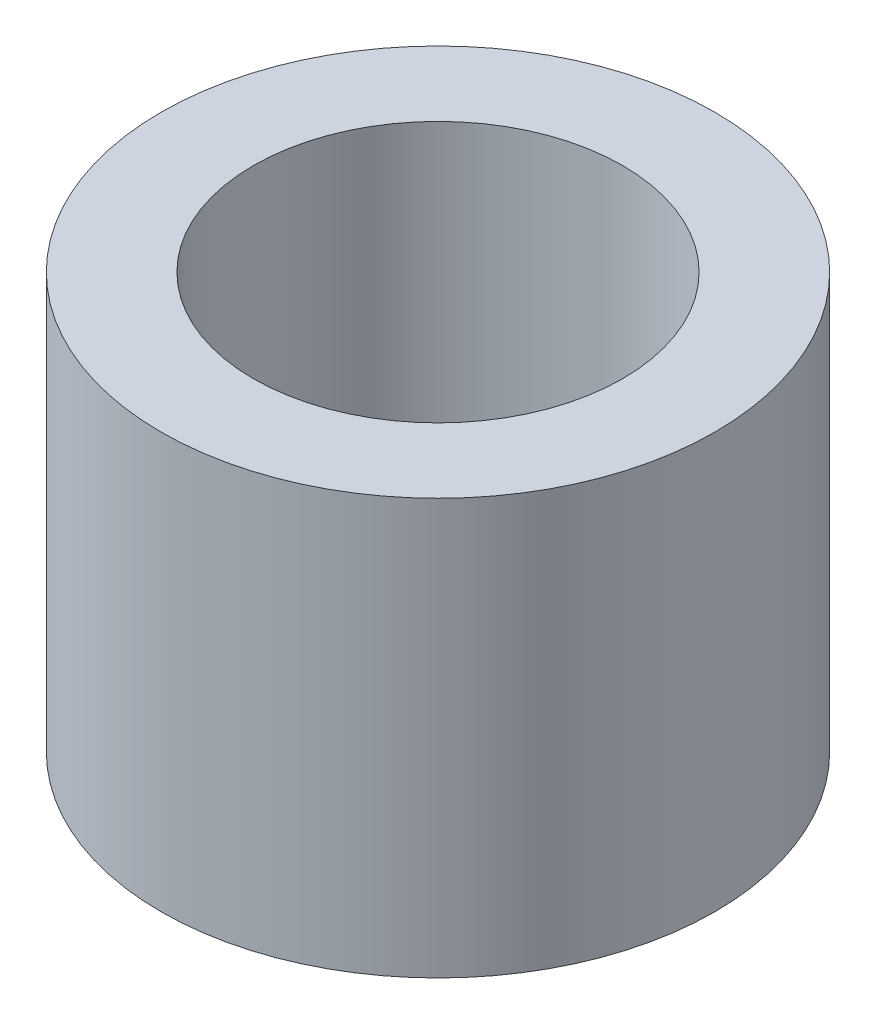
ISO-10303-21;
HEADER;
FILE_DESCRIPTION(('STEP AP214'),'2;1');
FILE_NAME('part.step','',(''),(''),'','','');
FILE_SCHEMA(('AUTOMOTIVE_DESIGN { 1 0 10303 214 1 1 1 1 }'));
ENDSEC;
DATA;
#1=APPLICATION_CONTEXT('core data for automotive mechanical design processes');
#2=APPLICATION_PROTOCOL_DEFINITION('international standard','automotive_design',2000,#1);
#3=PRODUCT_CONTEXT('',#1,'mechanical');
#4=PRODUCT('Part','Part','',(#3));
#5=PRODUCT_RELATED_PRODUCT_CATEGORY('part','',(#4));
#6=PRODUCT_DEFINITION_FORMATION('','',#4);
#7=PRODUCT_DEFINITION_CONTEXT('part definition',#1,'design');
#8=PRODUCT_DEFINITION('design','',#6,#7);
#9=PRODUCT_DEFINITION_SHAPE('','',#8);
#10=(LENGTH_UNIT() NAMED_UNIT(*) SI_UNIT(.MILLI.,.METRE.));
#11=(NAMED_UNIT(*) PLANE_ANGLE_UNIT() SI_UNIT($,.RADIAN.));
#12=(NAMED_UNIT(*) SI_UNIT($,.STERADIAN.) SOLID_ANGLE_UNIT());
#13=UNCERTAINTY_MEASURE_WITH_UNIT(LENGTH_MEASURE(1.E-05),#10,'distance_accuracy_value','');
#14=(GEOMETRIC_REPRESENTATION_CONTEXT(3) GLOBAL_UNCERTAINTY_ASSIGNED_CONTEXT((#13)) GLOBAL_UNIT_ASSIGNED_CONTEXT((#10,
#11,#12)) REPRESENTATION_CONTEXT('',''));
#15=CARTESIAN_POINT('',(0.,0.,0.));
#16=DIRECTION('',(0.,0.,1.));
#17=DIRECTION('',(1.,0.,0.));
#18=AXIS2_PLACEMENT_3D('',#15,#16,#17);
#19=CARTESIAN_POINT('',(0.,4.5,0.));
#20=DIRECTION('',(0.,-1.,0.));
#21=DIRECTION('',(0.,0.,-1.));
#22=AXIS2_PLACEMENT_3D('',#19,#20,#21);
#23=CYLINDRICAL_SURFACE('',#22,3.);
#24=CARTESIAN_POINT('',(0.,4.5,0.));
#25=DIRECTION('',(0.,1.,0.));
#26=DIRECTION('',(0.,0.,1.));
#27=AXIS2_PLACEMENT_3D('',#24,#25,#26);
#28=CIRCLE('',#27,3.);
#29=CARTESIAN_POINT('',(0.,4.5,3.));
#30=VERTEX_POINT('',#29);
#31=EDGE_CURVE('E10',#30,#30,#28,.T.);
#32=ORIENTED_EDGE('',*,*,#31,.F.);
#33=EDGE_LOOP('',(#32));
#34=FACE_BOUND('',#33,.T.);
#35=CARTESIAN_POINT('',(0.,0.,0.));
#36=DIRECTION('',(0.,1.,0.));
#37=DIRECTION('',(0.,0.,1.));
#38=AXIS2_PLACEMENT_3D('',#35,#36,#37);
#39=CIRCLE('',#38,3.);
#40=CARTESIAN_POINT('',(0.,0.,3.));
#41=VERTEX_POINT('',#40);
#42=EDGE_CURVE('E46',#41,#41,#39,.T.);
#43=ORIENTED_EDGE('',*,*,#42,.T.);
#44=EDGE_LOOP('',(#43));
#45=FACE_BOUND('',#44,.T.);
#46=ADVANCED_FACE('F43',(#34,#45),#23,.T.);
#47=CARTESIAN_POINT('',(0.,4.5,0.));
#48=DIRECTION('',(0.,1.,0.));
#49=DIRECTION('',(0.,0.,1.));
#50=AXIS2_PLACEMENT_3D('',#47,#48,#49);
#51=PLANE('',#50);
#52=CARTESIAN_POINT('',(0.,4.5,0.));
#53=DIRECTION('',(0.,1.,0.));
#54=DIRECTION('',(0.,0.,1.));
#55=AXIS2_PLACEMENT_3D('',#52,#53,#54);
#56=CIRCLE('',#55,2.);
#57=CARTESIAN_POINT('',(0.,4.5,2.));
#58=VERTEX_POINT('',#57);
#59=EDGE_CURVE('E57',#58,#58,#56,.T.);
#60=ORIENTED_EDGE('',*,*,#59,.F.);
#61=EDGE_LOOP('',(#60));
#62=FACE_BOUND('',#61,.T.);
#63=ORIENTED_EDGE('',*,*,#31,.T.);
#64=EDGE_LOOP('',(#63));
#65=FACE_BOUND('',#64,.T.);
#66=ADVANCED_FACE('F74',(#62,#65),#51,.T.);
#67=CARTESIAN_POINT('',(0.,0.,0.));
#68=DIRECTION('',(0.,1.,0.));
#69=DIRECTION('',(0.,0.,1.));
#70=AXIS2_PLACEMENT_3D('',#67,#68,#69);
#71=PLANE('',#70);
#72=CARTESIAN_POINT('',(0.,0.,0.));
#73=DIRECTION('',(0.,1.,0.));
#74=DIRECTION('',(0.,0.,1.));
#75=AXIS2_PLACEMENT_3D('',#72,#73,#74);
#76=CIRCLE('',#75,2.);
#77=CARTESIAN_POINT('',(0.,0.,2.));
#78=VERTEX_POINT('',#77);
#79=EDGE_CURVE('E55',#78,#78,#76,.T.);
#80=ORIENTED_EDGE('',*,*,#79,.T.);
#81=EDGE_LOOP('',(#80));
#82=FACE_BOUND('',#81,.T.);
#83=ORIENTED_EDGE('',*,*,#42,.F.);
#84=EDGE_LOOP('',(#83));
#85=FACE_BOUND('',#84,.T.);
#86=ADVANCED_FACE('F65',(#82,#85),#71,.F.);
#87=CARTESIAN_POINT('',(0.,0.,0.));
#88=DIRECTION('',(0.,1.,0.));
#89=DIRECTION('',(0.,0.,1.));
#90=AXIS2_PLACEMENT_3D('',#87,#88,#89);
#91=CYLINDRICAL_SURFACE('',#90,2.);
#92=ORIENTED_EDGE('',*,*,#79,.F.);
#93=EDGE_LOOP('',(#92));
#94=FACE_BOUND('',#93,.T.);
#95=ORIENTED_EDGE('',*,*,#59,.T.);
#96=EDGE_LOOP('',(#95));
#97=FACE_BOUND('',#96,.T.);
#98=ADVANCED_FACE('F68',(#94,#97),#91,.F.);
#99=CLOSED_SHELL('',(#46,#66,#86,#98));
#100=MANIFOLD_SOLID_BREP('B2',#99);
#101=ADVANCED_BREP_SHAPE_REPRESENTATION('',(#18,#100),#14);
#102=SHAPE_DEFINITION_REPRESENTATION(#9,#101);
ENDSEC;
END-ISO-10303-21;
